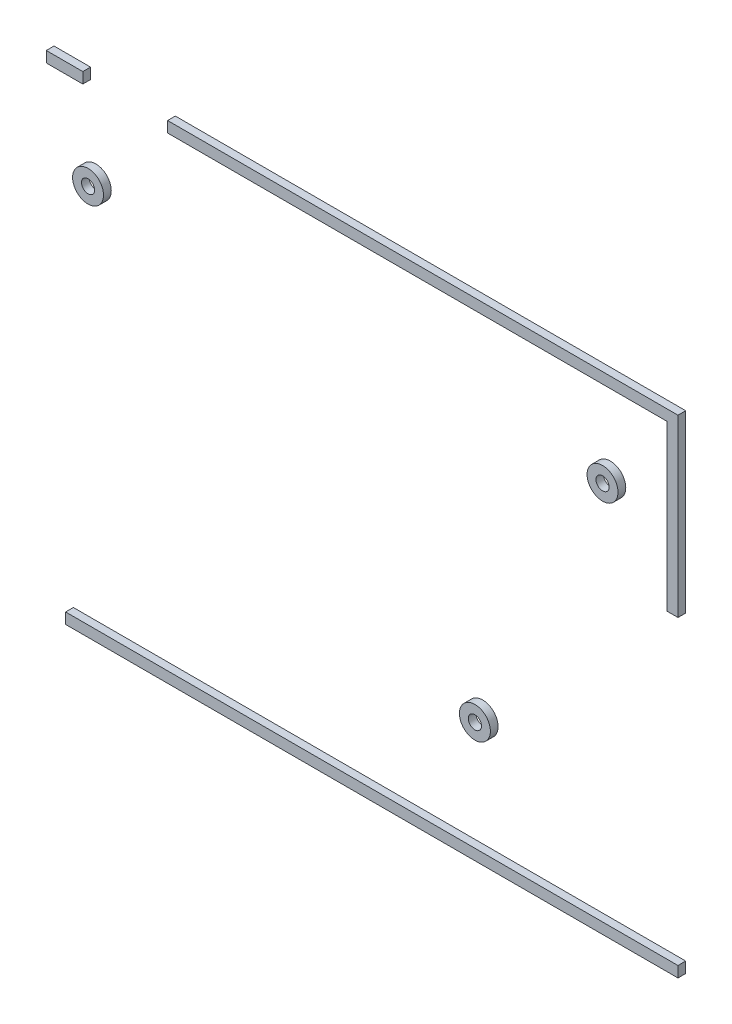
ISO-10303-21;
HEADER;
FILE_DESCRIPTION(('STEP AP214'),'2;1');
FILE_NAME('part.step','',(''),(''),'','','');
FILE_SCHEMA(('AUTOMOTIVE_DESIGN { 1 0 10303 214 1 1 1 1 }'));
ENDSEC;
DATA;
#1=APPLICATION_CONTEXT('core data for automotive mechanical design processes');
#2=APPLICATION_PROTOCOL_DEFINITION('international standard','automotive_design',2000,#1);
#3=PRODUCT_CONTEXT('',#1,'mechanical');
#4=PRODUCT('Part','Part','',(#3));
#5=PRODUCT_RELATED_PRODUCT_CATEGORY('part','',(#4));
#6=PRODUCT_DEFINITION_FORMATION('','',#4);
#7=PRODUCT_DEFINITION_CONTEXT('part definition',#1,'design');
#8=PRODUCT_DEFINITION('design','',#6,#7);
#9=PRODUCT_DEFINITION_SHAPE('','',#8);
#10=(LENGTH_UNIT() NAMED_UNIT(*) SI_UNIT(.MILLI.,.METRE.));
#11=(NAMED_UNIT(*) PLANE_ANGLE_UNIT() SI_UNIT($,.RADIAN.));
#12=(NAMED_UNIT(*) SI_UNIT($,.STERADIAN.) SOLID_ANGLE_UNIT());
#13=UNCERTAINTY_MEASURE_WITH_UNIT(LENGTH_MEASURE(1.E-05),#10,'distance_accuracy_value','');
#14=(GEOMETRIC_REPRESENTATION_CONTEXT(3) GLOBAL_UNCERTAINTY_ASSIGNED_CONTEXT((#13)) GLOBAL_UNIT_ASSIGNED_CONTEXT((#10,
#11,#12)) REPRESENTATION_CONTEXT('',''));
#15=CARTESIAN_POINT('',(0.,0.,0.));
#16=DIRECTION('',(0.,0.,1.));
#17=DIRECTION('',(1.,0.,0.));
#18=AXIS2_PLACEMENT_3D('',#15,#16,#17);
#19=CARTESIAN_POINT('',(176.,0.,160.32476117146));
#20=DIRECTION('',(1.,0.,0.));
#21=DIRECTION('',(0.,0.,-1.));
#22=AXIS2_PLACEMENT_3D('',#19,#20,#21);
#23=PLANE('',#22);
#24=DIRECTION('',(0.,0.,-1.));
#25=VECTOR('',#24,1.);
#26=CARTESIAN_POINT('',(176.,-60.2,160.32476117146));
#27=LINE('',#26,#25);
#28=CARTESIAN_POINT('',(176.,-60.2,2.));
#29=VERTEX_POINT('',#28);
#30=CARTESIAN_POINT('',(176.,-60.2,0.));
#31=VERTEX_POINT('',#30);
#32=EDGE_CURVE('E111',#29,#31,#27,.T.);
#33=ORIENTED_EDGE('',*,*,#32,.F.);
#34=DIRECTION('',(0.,1.,0.));
#35=VECTOR('',#34,1.);
#36=CARTESIAN_POINT('',(176.,0.,2.));
#37=LINE('',#36,#35);
#38=CARTESIAN_POINT('',(176.,-63.,2.));
#39=VERTEX_POINT('',#38);
#40=EDGE_CURVE('E70',#29,#39,#37,.F.);
#41=ORIENTED_EDGE('',*,*,#40,.T.);
#42=DIRECTION('',(0.,0.,-1.));
#43=VECTOR('',#42,1.);
#44=CARTESIAN_POINT('',(176.,-63.,160.32476117146));
#45=LINE('',#44,#43);
#46=CARTESIAN_POINT('',(176.,-63.,0.));
#47=VERTEX_POINT('',#46);
#48=EDGE_CURVE('E109',#39,#47,#45,.T.);
#49=ORIENTED_EDGE('',*,*,#48,.T.);
#50=DIRECTION('',(0.,-1.,0.));
#51=VECTOR('',#50,1.);
#52=CARTESIAN_POINT('',(176.,0.,0.));
#53=LINE('',#52,#51);
#54=EDGE_CURVE('E125',#31,#47,#53,.T.);
#55=ORIENTED_EDGE('',*,*,#54,.F.);
#56=EDGE_LOOP('',(#33,#41,#49,#55));
#57=FACE_BOUND('',#56,.T.);
#58=ADVANCED_FACE('F66',(#57),#23,.T.);
#59=CARTESIAN_POINT('',(0.,-60.2,160.32476117146));
#60=DIRECTION('',(0.,1.,0.));
#61=DIRECTION('',(0.,0.,1.));
#62=AXIS2_PLACEMENT_3D('',#59,#60,#61);
#63=PLANE('',#62);
#64=DIRECTION('',(0.,0.,-1.));
#65=VECTOR('',#64,1.);
#66=CARTESIAN_POINT('',(17.7,-60.2,160.32476117146));
#67=LINE('',#66,#65);
#68=CARTESIAN_POINT('',(17.7,-60.2,2.));
#69=VERTEX_POINT('',#68);
#70=CARTESIAN_POINT('',(17.7,-60.2,0.));
#71=VERTEX_POINT('',#70);
#72=EDGE_CURVE('E135',#69,#71,#67,.T.);
#73=ORIENTED_EDGE('',*,*,#72,.F.);
#74=DIRECTION('',(1.,0.,0.));
#75=VECTOR('',#74,1.);
#76=CARTESIAN_POINT('',(0.,-60.2,2.));
#77=LINE('',#76,#75);
#78=EDGE_CURVE('E85',#69,#29,#77,.T.);
#79=ORIENTED_EDGE('',*,*,#78,.T.);
#80=ORIENTED_EDGE('',*,*,#32,.T.);
#81=DIRECTION('',(1.,0.,0.));
#82=VECTOR('',#81,1.);
#83=CARTESIAN_POINT('',(0.,-60.2,0.));
#84=LINE('',#83,#82);
#85=EDGE_CURVE('E123',#71,#31,#84,.T.);
#86=ORIENTED_EDGE('',*,*,#85,.F.);
#87=EDGE_LOOP('',(#73,#79,#80,#86));
#88=FACE_BOUND('',#87,.T.);
#89=ADVANCED_FACE('F138',(#88),#63,.T.);
#90=CARTESIAN_POINT('',(17.7,0.,160.32476117146));
#91=DIRECTION('',(1.,0.,0.));
#92=DIRECTION('',(0.,0.,-1.));
#93=AXIS2_PLACEMENT_3D('',#90,#91,#92);
#94=PLANE('',#93);
#95=DIRECTION('',(0.,-1.,0.));
#96=VECTOR('',#95,1.);
#97=CARTESIAN_POINT('',(17.7,0.,2.));
#98=LINE('',#97,#96);
#99=CARTESIAN_POINT('',(17.7,-63.,2.));
#100=VERTEX_POINT('',#99);
#101=EDGE_CURVE('E77',#69,#100,#98,.T.);
#102=ORIENTED_EDGE('',*,*,#101,.F.);
#103=ORIENTED_EDGE('',*,*,#72,.T.);
#104=DIRECTION('',(0.,-1.,0.));
#105=VECTOR('',#104,1.);
#106=CARTESIAN_POINT('',(17.7,0.,0.));
#107=LINE('',#106,#105);
#108=CARTESIAN_POINT('',(17.7,-63.,0.));
#109=VERTEX_POINT('',#108);
#110=EDGE_CURVE('E132',#71,#109,#107,.T.);
#111=ORIENTED_EDGE('',*,*,#110,.T.);
#112=DIRECTION('',(0.,0.,-1.));
#113=VECTOR('',#112,1.);
#114=CARTESIAN_POINT('',(17.7,-63.,160.32476117146));
#115=LINE('',#114,#113);
#116=EDGE_CURVE('E120',#100,#109,#115,.T.);
#117=ORIENTED_EDGE('',*,*,#116,.F.);
#118=EDGE_LOOP('',(#102,#103,#111,#117));
#119=FACE_BOUND('',#118,.T.);
#120=ADVANCED_FACE('F142',(#119),#94,.F.);
#121=CARTESIAN_POINT('',(0.,-63.,160.32476117146));
#122=DIRECTION('',(0.,1.,0.));
#123=DIRECTION('',(0.,0.,1.));
#124=AXIS2_PLACEMENT_3D('',#121,#122,#123);
#125=PLANE('',#124);
#126=DIRECTION('',(1.,0.,0.));
#127=VECTOR('',#126,1.);
#128=CARTESIAN_POINT('',(-0.103234931084,-63.,1.99999999999999));
#129=LINE('',#128,#127);
#130=EDGE_CURVE('E13',#100,#39,#129,.T.);
#131=ORIENTED_EDGE('',*,*,#130,.F.);
#132=ORIENTED_EDGE('',*,*,#116,.T.);
#133=DIRECTION('',(1.,0.,0.));
#134=VECTOR('',#133,1.);
#135=CARTESIAN_POINT('',(0.,-63.,0.));
#136=LINE('',#135,#134);
#137=EDGE_CURVE('E115',#109,#47,#136,.T.);
#138=ORIENTED_EDGE('',*,*,#137,.T.);
#139=ORIENTED_EDGE('',*,*,#48,.F.);
#140=EDGE_LOOP('',(#131,#132,#138,#139));
#141=FACE_BOUND('',#140,.T.);
#142=ADVANCED_FACE('F113',(#141),#125,.F.);
#143=CARTESIAN_POINT('',(0.,0.,0.));
#144=DIRECTION('',(0.,0.,1.));
#145=DIRECTION('',(1.,0.,0.));
#146=AXIS2_PLACEMENT_3D('',#143,#144,#145);
#147=PLANE('',#146);
#148=ORIENTED_EDGE('',*,*,#54,.T.);
#149=ORIENTED_EDGE('',*,*,#137,.F.);
#150=ORIENTED_EDGE('',*,*,#110,.F.);
#151=ORIENTED_EDGE('',*,*,#85,.T.);
#152=EDGE_LOOP('',(#148,#149,#150,#151));
#153=FACE_BOUND('',#152,.T.);
#154=ADVANCED_FACE('F139',(#153),#147,.F.);
#155=CARTESIAN_POINT('',(-0.103234931084,0.02377597202222,1.99999999999999));
#156=DIRECTION('',(0.,0.,1.));
#157=DIRECTION('',(1.,0.,0.));
#158=AXIS2_PLACEMENT_3D('',#155,#156,#157);
#159=PLANE('',#158);
#160=ORIENTED_EDGE('',*,*,#101,.T.);
#161=ORIENTED_EDGE('',*,*,#130,.T.);
#162=ORIENTED_EDGE('',*,*,#40,.F.);
#163=ORIENTED_EDGE('',*,*,#78,.F.);
#164=EDGE_LOOP('',(#160,#161,#162,#163));
#165=FACE_BOUND('',#164,.T.);
#166=ADVANCED_FACE('F68',(#165),#159,.T.);
#167=CLOSED_SHELL('',(#58,#89,#120,#142,#154,#166));
#168=MANIFOLD_SOLID_BREP('B2',#167);
#169=CARTESIAN_POINT('',(123.5,-32.,160.32476117146));
#170=DIRECTION('',(0.,0.,-1.));
#171=DIRECTION('',(-1.,0.,0.));
#172=AXIS2_PLACEMENT_3D('',#169,#170,#171);
#173=CYLINDRICAL_SURFACE('',#172,1.70000000000001);
#174=CARTESIAN_POINT('',(123.5,-32.,0.));
#175=DIRECTION('',(0.,0.,1.));
#176=DIRECTION('',(1.,0.,0.));
#177=AXIS2_PLACEMENT_3D('',#174,#175,#176);
#178=CIRCLE('',#177,1.70000000000001);
#179=CARTESIAN_POINT('',(125.2,-32.,0.));
#180=VERTEX_POINT('',#179);
#181=EDGE_CURVE('E212',#180,#180,#178,.T.);
#182=ORIENTED_EDGE('',*,*,#181,.F.);
#183=EDGE_LOOP('',(#182));
#184=FACE_BOUND('',#183,.T.);
#185=CARTESIAN_POINT('',(123.5,-32.,2.));
#186=DIRECTION('',(0.,0.,1.));
#187=DIRECTION('',(1.,0.,0.));
#188=AXIS2_PLACEMENT_3D('',#185,#186,#187);
#189=CIRCLE('',#188,1.70000000000001);
#190=CARTESIAN_POINT('',(125.2,-32.,2.));
#191=VERTEX_POINT('',#190);
#192=EDGE_CURVE('E221',#191,#191,#189,.T.);
#193=ORIENTED_EDGE('',*,*,#192,.T.);
#194=EDGE_LOOP('',(#193));
#195=FACE_BOUND('',#194,.T.);
#196=ADVANCED_FACE('F205',(#184,#195),#173,.F.);
#197=CARTESIAN_POINT('',(123.5,-32.,160.32476117146));
#198=DIRECTION('',(0.,0.,-1.));
#199=DIRECTION('',(-1.,0.,0.));
#200=AXIS2_PLACEMENT_3D('',#197,#198,#199);
#201=CYLINDRICAL_SURFACE('',#200,3.99999999999999);
#202=CARTESIAN_POINT('',(123.5,-32.,0.));
#203=DIRECTION('',(0.,0.,1.));
#204=DIRECTION('',(1.,0.,0.));
#205=AXIS2_PLACEMENT_3D('',#202,#203,#204);
#206=CIRCLE('',#205,3.99999999999999);
#207=CARTESIAN_POINT('',(127.5,-32.,0.));
#208=VERTEX_POINT('',#207);
#209=EDGE_CURVE('E216',#208,#208,#206,.T.);
#210=ORIENTED_EDGE('',*,*,#209,.T.);
#211=EDGE_LOOP('',(#210));
#212=FACE_BOUND('',#211,.T.);
#213=CARTESIAN_POINT('',(123.5,-32.,2.));
#214=DIRECTION('',(0.,0.,1.));
#215=DIRECTION('',(1.,0.,0.));
#216=AXIS2_PLACEMENT_3D('',#213,#214,#215);
#217=CIRCLE('',#216,3.99999999999999);
#218=CARTESIAN_POINT('',(127.5,-32.,2.));
#219=VERTEX_POINT('',#218);
#220=EDGE_CURVE('E65',#219,#219,#217,.T.);
#221=ORIENTED_EDGE('',*,*,#220,.F.);
#222=EDGE_LOOP('',(#221));
#223=FACE_BOUND('',#222,.T.);
#224=ADVANCED_FACE('F232',(#212,#223),#201,.T.);
#225=CARTESIAN_POINT('',(0.,0.,0.));
#226=DIRECTION('',(0.,0.,1.));
#227=DIRECTION('',(1.,0.,0.));
#228=AXIS2_PLACEMENT_3D('',#225,#226,#227);
#229=PLANE('',#228);
#230=ORIENTED_EDGE('',*,*,#181,.T.);
#231=EDGE_LOOP('',(#230));
#232=FACE_BOUND('',#231,.T.);
#233=ORIENTED_EDGE('',*,*,#209,.F.);
#234=EDGE_LOOP('',(#233));
#235=FACE_BOUND('',#234,.T.);
#236=ADVANCED_FACE('F228',(#232,#235),#229,.F.);
#237=CARTESIAN_POINT('',(-0.103234931084,0.02377597202222,1.99999999999999));
#238=DIRECTION('',(0.,0.,1.));
#239=DIRECTION('',(1.,0.,0.));
#240=AXIS2_PLACEMENT_3D('',#237,#238,#239);
#241=PLANE('',#240);
#242=ORIENTED_EDGE('',*,*,#192,.F.);
#243=EDGE_LOOP('',(#242));
#244=FACE_BOUND('',#243,.T.);
#245=ORIENTED_EDGE('',*,*,#220,.T.);
#246=EDGE_LOOP('',(#245));
#247=FACE_BOUND('',#246,.T.);
#248=ADVANCED_FACE('F207',(#244,#247),#241,.T.);
#249=CLOSED_SHELL('',(#196,#224,#236,#248));
#250=MANIFOLD_SOLID_BREP('B7',#249);
#251=CARTESIAN_POINT('',(156.5,38.,160.32476117146));
#252=DIRECTION('',(0.,0.,-1.));
#253=DIRECTION('',(-1.,0.,0.));
#254=AXIS2_PLACEMENT_3D('',#251,#252,#253);
#255=CYLINDRICAL_SURFACE('',#254,1.70000000000001);
#256=CARTESIAN_POINT('',(156.5,38.,0.));
#257=DIRECTION('',(0.,0.,1.));
#258=DIRECTION('',(1.,0.,0.));
#259=AXIS2_PLACEMENT_3D('',#256,#257,#258);
#260=CIRCLE('',#259,1.70000000000001);
#261=CARTESIAN_POINT('',(158.2,38.,0.));
#262=VERTEX_POINT('',#261);
#263=EDGE_CURVE('E283',#262,#262,#260,.T.);
#264=ORIENTED_EDGE('',*,*,#263,.F.);
#265=EDGE_LOOP('',(#264));
#266=FACE_BOUND('',#265,.T.);
#267=CARTESIAN_POINT('',(156.5,38.,2.));
#268=DIRECTION('',(0.,0.,1.));
#269=DIRECTION('',(1.,0.,0.));
#270=AXIS2_PLACEMENT_3D('',#267,#268,#269);
#271=CIRCLE('',#270,1.70000000000001);
#272=CARTESIAN_POINT('',(158.2,38.,2.));
#273=VERTEX_POINT('',#272);
#274=EDGE_CURVE('E292',#273,#273,#271,.T.);
#275=ORIENTED_EDGE('',*,*,#274,.T.);
#276=EDGE_LOOP('',(#275));
#277=FACE_BOUND('',#276,.T.);
#278=ADVANCED_FACE('F276',(#266,#277),#255,.F.);
#279=CARTESIAN_POINT('',(156.5,38.,160.32476117146));
#280=DIRECTION('',(0.,0.,-1.));
#281=DIRECTION('',(-1.,0.,0.));
#282=AXIS2_PLACEMENT_3D('',#279,#280,#281);
#283=CYLINDRICAL_SURFACE('',#282,3.99999999999999);
#284=CARTESIAN_POINT('',(156.5,38.,0.));
#285=DIRECTION('',(0.,0.,1.));
#286=DIRECTION('',(1.,0.,0.));
#287=AXIS2_PLACEMENT_3D('',#284,#285,#286);
#288=CIRCLE('',#287,3.99999999999999);
#289=CARTESIAN_POINT('',(160.5,38.,0.));
#290=VERTEX_POINT('',#289);
#291=EDGE_CURVE('E287',#290,#290,#288,.T.);
#292=ORIENTED_EDGE('',*,*,#291,.T.);
#293=EDGE_LOOP('',(#292));
#294=FACE_BOUND('',#293,.T.);
#295=CARTESIAN_POINT('',(156.5,38.,2.));
#296=DIRECTION('',(0.,0.,1.));
#297=DIRECTION('',(1.,0.,0.));
#298=AXIS2_PLACEMENT_3D('',#295,#296,#297);
#299=CIRCLE('',#298,3.99999999999999);
#300=CARTESIAN_POINT('',(160.5,38.,2.));
#301=VERTEX_POINT('',#300);
#302=EDGE_CURVE('E204',#301,#301,#299,.T.);
#303=ORIENTED_EDGE('',*,*,#302,.F.);
#304=EDGE_LOOP('',(#303));
#305=FACE_BOUND('',#304,.T.);
#306=ADVANCED_FACE('F303',(#294,#305),#283,.T.);
#307=CARTESIAN_POINT('',(0.,0.,0.));
#308=DIRECTION('',(0.,0.,1.));
#309=DIRECTION('',(1.,0.,0.));
#310=AXIS2_PLACEMENT_3D('',#307,#308,#309);
#311=PLANE('',#310);
#312=ORIENTED_EDGE('',*,*,#263,.T.);
#313=EDGE_LOOP('',(#312));
#314=FACE_BOUND('',#313,.T.);
#315=ORIENTED_EDGE('',*,*,#291,.F.);
#316=EDGE_LOOP('',(#315));
#317=FACE_BOUND('',#316,.T.);
#318=ADVANCED_FACE('F299',(#314,#317),#311,.F.);
#319=CARTESIAN_POINT('',(-0.103234931084,0.02377597202222,1.99999999999999));
#320=DIRECTION('',(0.,0.,1.));
#321=DIRECTION('',(1.,0.,0.));
#322=AXIS2_PLACEMENT_3D('',#319,#320,#321);
#323=PLANE('',#322);
#324=ORIENTED_EDGE('',*,*,#274,.F.);
#325=EDGE_LOOP('',(#324));
#326=FACE_BOUND('',#325,.T.);
#327=ORIENTED_EDGE('',*,*,#302,.T.);
#328=EDGE_LOOP('',(#327));
#329=FACE_BOUND('',#328,.T.);
#330=ADVANCED_FACE('F278',(#326,#329),#323,.T.);
#331=CLOSED_SHELL('',(#278,#306,#318,#330));
#332=MANIFOLD_SOLID_BREP('B60',#331);
#333=CARTESIAN_POINT('',(0.,63.,160.32476117146));
#334=DIRECTION('',(0.,-1.,0.));
#335=DIRECTION('',(0.,0.,-1.));
#336=AXIS2_PLACEMENT_3D('',#333,#334,#335);
#337=PLANE('',#336);
#338=DIRECTION('',(1.,0.,0.));
#339=VECTOR('',#338,1.);
#340=CARTESIAN_POINT('',(-0.103234931084,63.,1.99999999999999));
#341=LINE('',#340,#339);
#342=CARTESIAN_POINT('',(176.,63.,1.99999999999999));
#343=VERTEX_POINT('',#342);
#344=CARTESIAN_POINT('',(44.0607929126358,63.,2.));
#345=VERTEX_POINT('',#344);
#346=EDGE_CURVE('E274',#343,#345,#341,.F.);
#347=ORIENTED_EDGE('',*,*,#346,.F.);
#348=DIRECTION('',(0.,0.,-1.));
#349=VECTOR('',#348,1.);
#350=CARTESIAN_POINT('',(176.,63.,160.32476117146));
#351=LINE('',#350,#349);
#352=CARTESIAN_POINT('',(176.,63.,0.));
#353=VERTEX_POINT('',#352);
#354=EDGE_CURVE('E429',#343,#353,#351,.T.);
#355=ORIENTED_EDGE('',*,*,#354,.T.);
#356=DIRECTION('',(-1.,0.,0.));
#357=VECTOR('',#356,1.);
#358=CARTESIAN_POINT('',(0.,63.,0.));
#359=LINE('',#358,#357);
#360=CARTESIAN_POINT('',(44.0607929126358,63.,0.));
#361=VERTEX_POINT('',#360);
#362=EDGE_CURVE('E418',#353,#361,#359,.T.);
#363=ORIENTED_EDGE('',*,*,#362,.T.);
#364=DIRECTION('',(0.,0.,-1.));
#365=VECTOR('',#364,1.);
#366=CARTESIAN_POINT('',(44.0607929126358,63.,160.32476117146));
#367=LINE('',#366,#365);
#368=EDGE_CURVE('E424',#345,#361,#367,.T.);
#369=ORIENTED_EDGE('',*,*,#368,.F.);
#370=EDGE_LOOP('',(#347,#355,#363,#369));
#371=FACE_BOUND('',#370,.T.);
#372=ADVANCED_FACE('F345',(#371),#337,.F.);
#373=CARTESIAN_POINT('',(44.0607929126358,0.,160.32476117146));
#374=DIRECTION('',(1.,0.,0.));
#375=DIRECTION('',(0.,0.,-1.));
#376=AXIS2_PLACEMENT_3D('',#373,#374,#375);
#377=PLANE('',#376);
#378=DIRECTION('',(0.,-1.,0.));
#379=VECTOR('',#378,1.);
#380=CARTESIAN_POINT('',(44.0607929126358,0.,2.));
#381=LINE('',#380,#379);
#382=CARTESIAN_POINT('',(44.0607929126358,60.2,2.));
#383=VERTEX_POINT('',#382);
#384=EDGE_CURVE('E391',#345,#383,#381,.T.);
#385=ORIENTED_EDGE('',*,*,#384,.F.);
#386=ORIENTED_EDGE('',*,*,#368,.T.);
#387=DIRECTION('',(0.,-1.,0.));
#388=VECTOR('',#387,1.);
#389=CARTESIAN_POINT('',(44.0607929126358,0.,0.));
#390=LINE('',#389,#388);
#391=CARTESIAN_POINT('',(44.0607929126358,60.2,0.));
#392=VERTEX_POINT('',#391);
#393=EDGE_CURVE('E408',#361,#392,#390,.T.);
#394=ORIENTED_EDGE('',*,*,#393,.T.);
#395=DIRECTION('',(0.,0.,-1.));
#396=VECTOR('',#395,1.);
#397=CARTESIAN_POINT('',(44.0607929126358,60.2,160.32476117146));
#398=LINE('',#397,#396);
#399=EDGE_CURVE('E405',#383,#392,#398,.T.);
#400=ORIENTED_EDGE('',*,*,#399,.F.);
#401=EDGE_LOOP('',(#385,#386,#394,#400));
#402=FACE_BOUND('',#401,.T.);
#403=ADVANCED_FACE('F410',(#402),#377,.F.);
#404=CARTESIAN_POINT('',(0.,60.2,160.32476117146));
#405=DIRECTION('',(0.,-1.,0.));
#406=DIRECTION('',(0.,0.,-1.));
#407=AXIS2_PLACEMENT_3D('',#404,#405,#406);
#408=PLANE('',#407);
#409=DIRECTION('',(0.,0.,-1.));
#410=VECTOR('',#409,1.);
#411=CARTESIAN_POINT('',(173.2,60.2,160.32476117146));
#412=LINE('',#411,#410);
#413=CARTESIAN_POINT('',(173.2,60.2,2.));
#414=VERTEX_POINT('',#413);
#415=CARTESIAN_POINT('',(173.2,60.2,0.));
#416=VERTEX_POINT('',#415);
#417=EDGE_CURVE('E407',#414,#416,#412,.T.);
#418=ORIENTED_EDGE('',*,*,#417,.F.);
#419=DIRECTION('',(-1.,0.,0.));
#420=VECTOR('',#419,1.);
#421=CARTESIAN_POINT('',(0.,60.2,2.));
#422=LINE('',#421,#420);
#423=EDGE_CURVE('E393',#414,#383,#422,.T.);
#424=ORIENTED_EDGE('',*,*,#423,.T.);
#425=ORIENTED_EDGE('',*,*,#399,.T.);
#426=DIRECTION('',(-1.,0.,0.));
#427=VECTOR('',#426,1.);
#428=CARTESIAN_POINT('',(0.,60.2,0.));
#429=LINE('',#428,#427);
#430=EDGE_CURVE('E399',#416,#392,#429,.T.);
#431=ORIENTED_EDGE('',*,*,#430,.F.);
#432=EDGE_LOOP('',(#418,#424,#425,#431));
#433=FACE_BOUND('',#432,.T.);
#434=ADVANCED_FACE('F403',(#433),#408,.T.);
#435=CARTESIAN_POINT('',(173.2,0.,160.32476117146));
#436=DIRECTION('',(-1.,0.,0.));
#437=DIRECTION('',(0.,0.,1.));
#438=AXIS2_PLACEMENT_3D('',#435,#436,#437);
#439=PLANE('',#438);
#440=DIRECTION('',(0.,0.,-1.));
#441=VECTOR('',#440,1.);
#442=CARTESIAN_POINT('',(173.2,17.7,160.32476117146));
#443=LINE('',#442,#441);
#444=CARTESIAN_POINT('',(173.2,17.7,2.));
#445=VERTEX_POINT('',#444);
#446=CARTESIAN_POINT('',(173.2,17.7,0.));
#447=VERTEX_POINT('',#446);
#448=EDGE_CURVE('E421',#445,#447,#443,.T.);
#449=ORIENTED_EDGE('',*,*,#448,.F.);
#450=DIRECTION('',(0.,1.,0.));
#451=VECTOR('',#450,1.);
#452=CARTESIAN_POINT('',(173.2,0.,2.));
#453=LINE('',#452,#451);
#454=EDGE_CURVE('E413',#445,#414,#453,.T.);
#455=ORIENTED_EDGE('',*,*,#454,.T.);
#456=ORIENTED_EDGE('',*,*,#417,.T.);
#457=DIRECTION('',(0.,1.,0.));
#458=VECTOR('',#457,1.);
#459=CARTESIAN_POINT('',(173.2,0.,0.));
#460=LINE('',#459,#458);
#461=EDGE_CURVE('E458',#447,#416,#460,.T.);
#462=ORIENTED_EDGE('',*,*,#461,.F.);
#463=EDGE_LOOP('',(#449,#455,#456,#462));
#464=FACE_BOUND('',#463,.T.);
#465=ADVANCED_FACE('F463',(#464),#439,.T.);
#466=CARTESIAN_POINT('',(0.,17.7,160.32476117146));
#467=DIRECTION('',(0.,1.,0.));
#468=DIRECTION('',(0.,0.,1.));
#469=AXIS2_PLACEMENT_3D('',#466,#467,#468);
#470=PLANE('',#469);
#471=DIRECTION('',(1.,0.,0.));
#472=VECTOR('',#471,1.);
#473=CARTESIAN_POINT('',(0.,17.7,2.));
#474=LINE('',#473,#472);
#475=CARTESIAN_POINT('',(176.,17.7,2.));
#476=VERTEX_POINT('',#475);
#477=EDGE_CURVE('E398',#445,#476,#474,.T.);
#478=ORIENTED_EDGE('',*,*,#477,.F.);
#479=ORIENTED_EDGE('',*,*,#448,.T.);
#480=DIRECTION('',(1.,0.,0.));
#481=VECTOR('',#480,1.);
#482=CARTESIAN_POINT('',(0.,17.7,0.));
#483=LINE('',#482,#481);
#484=CARTESIAN_POINT('',(176.,17.7,0.));
#485=VERTEX_POINT('',#484);
#486=EDGE_CURVE('E422',#447,#485,#483,.T.);
#487=ORIENTED_EDGE('',*,*,#486,.T.);
#488=DIRECTION('',(0.,0.,-1.));
#489=VECTOR('',#488,1.);
#490=CARTESIAN_POINT('',(176.,17.7,160.32476117146));
#491=LINE('',#490,#489);
#492=EDGE_CURVE('E426',#476,#485,#491,.T.);
#493=ORIENTED_EDGE('',*,*,#492,.F.);
#494=EDGE_LOOP('',(#478,#479,#487,#493));
#495=FACE_BOUND('',#494,.T.);
#496=ADVANCED_FACE('F443',(#495),#470,.F.);
#497=CARTESIAN_POINT('',(176.,0.,160.32476117146));
#498=DIRECTION('',(-1.,0.,0.));
#499=DIRECTION('',(0.,0.,1.));
#500=AXIS2_PLACEMENT_3D('',#497,#498,#499);
#501=PLANE('',#500);
#502=DIRECTION('',(0.,1.,0.));
#503=VECTOR('',#502,1.);
#504=CARTESIAN_POINT('',(176.,0.02377597202222,1.99999999999999));
#505=LINE('',#504,#503);
#506=EDGE_CURVE('E354',#476,#343,#505,.T.);
#507=ORIENTED_EDGE('',*,*,#506,.F.);
#508=ORIENTED_EDGE('',*,*,#492,.T.);
#509=DIRECTION('',(0.,1.,0.));
#510=VECTOR('',#509,1.);
#511=CARTESIAN_POINT('',(176.,0.,0.));
#512=LINE('',#511,#510);
#513=EDGE_CURVE('E428',#485,#353,#512,.T.);
#514=ORIENTED_EDGE('',*,*,#513,.T.);
#515=ORIENTED_EDGE('',*,*,#354,.F.);
#516=EDGE_LOOP('',(#507,#508,#514,#515));
#517=FACE_BOUND('',#516,.T.);
#518=ADVANCED_FACE('F449',(#517),#501,.F.);
#519=CARTESIAN_POINT('',(0.,0.,0.));
#520=DIRECTION('',(0.,0.,1.));
#521=DIRECTION('',(1.,0.,0.));
#522=AXIS2_PLACEMENT_3D('',#519,#520,#521);
#523=PLANE('',#522);
#524=ORIENTED_EDGE('',*,*,#362,.F.);
#525=ORIENTED_EDGE('',*,*,#513,.F.);
#526=ORIENTED_EDGE('',*,*,#486,.F.);
#527=ORIENTED_EDGE('',*,*,#461,.T.);
#528=ORIENTED_EDGE('',*,*,#430,.T.);
#529=ORIENTED_EDGE('',*,*,#393,.F.);
#530=EDGE_LOOP('',(#524,#525,#526,#527,#528,#529));
#531=FACE_BOUND('',#530,.T.);
#532=ADVANCED_FACE('F454',(#531),#523,.F.);
#533=CARTESIAN_POINT('',(-0.103234931084,0.02377597202222,1.99999999999999));
#534=DIRECTION('',(0.,0.,1.));
#535=DIRECTION('',(1.,0.,0.));
#536=AXIS2_PLACEMENT_3D('',#533,#534,#535);
#537=PLANE('',#536);
#538=ORIENTED_EDGE('',*,*,#384,.T.);
#539=ORIENTED_EDGE('',*,*,#423,.F.);
#540=ORIENTED_EDGE('',*,*,#454,.F.);
#541=ORIENTED_EDGE('',*,*,#477,.T.);
#542=ORIENTED_EDGE('',*,*,#506,.T.);
#543=ORIENTED_EDGE('',*,*,#346,.T.);
#544=EDGE_LOOP('',(#538,#539,#540,#541,#542,#543));
#545=FACE_BOUND('',#544,.T.);
#546=ADVANCED_FACE('F347',(#545),#537,.T.);
#547=CLOSED_SHELL('',(#372,#403,#434,#465,#496,#518,#532,#546));
#548=MANIFOLD_SOLID_BREP('B199',#547);
#549=CARTESIAN_POINT('',(23.5,38.,160.32476117146));
#550=DIRECTION('',(0.,0.,-1.));
#551=DIRECTION('',(-1.,0.,0.));
#552=AXIS2_PLACEMENT_3D('',#549,#550,#551);
#553=CYLINDRICAL_SURFACE('',#552,1.7);
#554=CARTESIAN_POINT('',(23.5,38.,0.));
#555=DIRECTION('',(0.,0.,1.));
#556=DIRECTION('',(1.,0.,0.));
#557=AXIS2_PLACEMENT_3D('',#554,#555,#556);
#558=CIRCLE('',#557,1.7);
#559=CARTESIAN_POINT('',(25.2,38.,0.));
#560=VERTEX_POINT('',#559);
#561=EDGE_CURVE('E553',#560,#560,#558,.T.);
#562=ORIENTED_EDGE('',*,*,#561,.F.);
#563=EDGE_LOOP('',(#562));
#564=FACE_BOUND('',#563,.T.);
#565=CARTESIAN_POINT('',(23.5,38.,2.));
#566=DIRECTION('',(0.,0.,1.));
#567=DIRECTION('',(1.,0.,0.));
#568=AXIS2_PLACEMENT_3D('',#565,#566,#567);
#569=CIRCLE('',#568,1.7);
#570=CARTESIAN_POINT('',(25.2,38.,2.));
#571=VERTEX_POINT('',#570);
#572=EDGE_CURVE('E562',#571,#571,#569,.T.);
#573=ORIENTED_EDGE('',*,*,#572,.T.);
#574=EDGE_LOOP('',(#573));
#575=FACE_BOUND('',#574,.T.);
#576=ADVANCED_FACE('F546',(#564,#575),#553,.F.);
#577=CARTESIAN_POINT('',(23.5,38.,160.32476117146));
#578=DIRECTION('',(0.,0.,-1.));
#579=DIRECTION('',(-1.,0.,0.));
#580=AXIS2_PLACEMENT_3D('',#577,#578,#579);
#581=CYLINDRICAL_SURFACE('',#580,4.);
#582=CARTESIAN_POINT('',(23.5,38.,0.));
#583=DIRECTION('',(0.,0.,1.));
#584=DIRECTION('',(1.,0.,0.));
#585=AXIS2_PLACEMENT_3D('',#582,#583,#584);
#586=CIRCLE('',#585,4.);
#587=CARTESIAN_POINT('',(27.5,38.,0.));
#588=VERTEX_POINT('',#587);
#589=EDGE_CURVE('E557',#588,#588,#586,.T.);
#590=ORIENTED_EDGE('',*,*,#589,.T.);
#591=EDGE_LOOP('',(#590));
#592=FACE_BOUND('',#591,.T.);
#593=CARTESIAN_POINT('',(23.5,38.,2.));
#594=DIRECTION('',(0.,0.,1.));
#595=DIRECTION('',(1.,0.,0.));
#596=AXIS2_PLACEMENT_3D('',#593,#594,#595);
#597=CIRCLE('',#596,4.);
#598=CARTESIAN_POINT('',(27.5,38.,2.));
#599=VERTEX_POINT('',#598);
#600=EDGE_CURVE('E344',#599,#599,#597,.T.);
#601=ORIENTED_EDGE('',*,*,#600,.F.);
#602=EDGE_LOOP('',(#601));
#603=FACE_BOUND('',#602,.T.);
#604=ADVANCED_FACE('F573',(#592,#603),#581,.T.);
#605=CARTESIAN_POINT('',(0.,0.,0.));
#606=DIRECTION('',(0.,0.,1.));
#607=DIRECTION('',(1.,0.,0.));
#608=AXIS2_PLACEMENT_3D('',#605,#606,#607);
#609=PLANE('',#608);
#610=ORIENTED_EDGE('',*,*,#561,.T.);
#611=EDGE_LOOP('',(#610));
#612=FACE_BOUND('',#611,.T.);
#613=ORIENTED_EDGE('',*,*,#589,.F.);
#614=EDGE_LOOP('',(#613));
#615=FACE_BOUND('',#614,.T.);
#616=ADVANCED_FACE('F569',(#612,#615),#609,.F.);
#617=CARTESIAN_POINT('',(-0.103234931084,0.02377597202222,1.99999999999999));
#618=DIRECTION('',(0.,0.,1.));
#619=DIRECTION('',(1.,0.,0.));
#620=AXIS2_PLACEMENT_3D('',#617,#618,#619);
#621=PLANE('',#620);
#622=ORIENTED_EDGE('',*,*,#572,.F.);
#623=EDGE_LOOP('',(#622));
#624=FACE_BOUND('',#623,.T.);
#625=ORIENTED_EDGE('',*,*,#600,.T.);
#626=EDGE_LOOP('',(#625));
#627=FACE_BOUND('',#626,.T.);
#628=ADVANCED_FACE('F548',(#624,#627),#621,.T.);
#629=CLOSED_SHELL('',(#576,#604,#616,#628));
#630=MANIFOLD_SOLID_BREP('B268',#629);
#631=CARTESIAN_POINT('',(0.,0.,0.));
#632=DIRECTION('',(0.,0.,1.));
#633=DIRECTION('',(1.,0.,0.));
#634=AXIS2_PLACEMENT_3D('',#631,#632,#633);
#635=PLANE('',#634);
#636=DIRECTION('',(1.,0.,0.));
#637=VECTOR('',#636,1.);
#638=CARTESIAN_POINT('',(0.,60.2,0.));
#639=LINE('',#638,#637);
#640=CARTESIAN_POINT('',(12.7,60.2,0.));
#641=VERTEX_POINT('',#640);
#642=CARTESIAN_POINT('',(22.1392070873642,60.2,0.));
#643=VERTEX_POINT('',#642);
#644=EDGE_CURVE('E663',#641,#643,#639,.T.);
#645=ORIENTED_EDGE('',*,*,#644,.F.);
#646=DIRECTION('',(0.,1.,0.));
#647=VECTOR('',#646,1.);
#648=CARTESIAN_POINT('',(12.7,0.,0.));
#649=LINE('',#648,#647);
#650=CARTESIAN_POINT('',(12.7,63.,0.));
#651=VERTEX_POINT('',#650);
#652=EDGE_CURVE('E672',#641,#651,#649,.T.);
#653=ORIENTED_EDGE('',*,*,#652,.T.);
#654=DIRECTION('',(1.,0.,0.));
#655=VECTOR('',#654,1.);
#656=CARTESIAN_POINT('',(0.,63.,0.));
#657=LINE('',#656,#655);
#658=CARTESIAN_POINT('',(22.1392070873642,63.,0.));
#659=VERTEX_POINT('',#658);
#660=EDGE_CURVE('E666',#651,#659,#657,.T.);
#661=ORIENTED_EDGE('',*,*,#660,.T.);
#662=DIRECTION('',(0.,1.,0.));
#663=VECTOR('',#662,1.);
#664=CARTESIAN_POINT('',(22.1392070873642,0.,0.));
#665=LINE('',#664,#663);
#666=EDGE_CURVE('E657',#643,#659,#665,.T.);
#667=ORIENTED_EDGE('',*,*,#666,.F.);
#668=EDGE_LOOP('',(#645,#653,#661,#667));
#669=FACE_BOUND('',#668,.T.);
#670=ADVANCED_FACE('F607',(#669),#635,.F.);
#671=CARTESIAN_POINT('',(12.7,0.,160.32476117146));
#672=DIRECTION('',(-1.,0.,0.));
#673=DIRECTION('',(0.,0.,1.));
#674=AXIS2_PLACEMENT_3D('',#671,#672,#673);
#675=PLANE('',#674);
#676=DIRECTION('',(0.,0.,-1.));
#677=VECTOR('',#676,1.);
#678=CARTESIAN_POINT('',(12.7,60.2,160.32476117146));
#679=LINE('',#678,#677);
#680=CARTESIAN_POINT('',(12.7,60.2,2.));
#681=VERTEX_POINT('',#680);
#682=EDGE_CURVE('E641',#681,#641,#679,.T.);
#683=ORIENTED_EDGE('',*,*,#682,.F.);
#684=DIRECTION('',(0.,1.,0.));
#685=VECTOR('',#684,1.);
#686=CARTESIAN_POINT('',(12.7,0.,2.));
#687=LINE('',#686,#685);
#688=CARTESIAN_POINT('',(12.7,63.,2.));
#689=VERTEX_POINT('',#688);
#690=EDGE_CURVE('E628',#681,#689,#687,.T.);
#691=ORIENTED_EDGE('',*,*,#690,.T.);
#692=DIRECTION('',(0.,0.,-1.));
#693=VECTOR('',#692,1.);
#694=CARTESIAN_POINT('',(12.7,63.,160.32476117146));
#695=LINE('',#694,#693);
#696=EDGE_CURVE('E675',#689,#651,#695,.T.);
#697=ORIENTED_EDGE('',*,*,#696,.T.);
#698=ORIENTED_EDGE('',*,*,#652,.F.);
#699=EDGE_LOOP('',(#683,#691,#697,#698));
#700=FACE_BOUND('',#699,.T.);
#701=ADVANCED_FACE('F683',(#700),#675,.T.);
#702=CARTESIAN_POINT('',(0.,63.,160.32476117146));
#703=DIRECTION('',(0.,1.,0.));
#704=DIRECTION('',(0.,0.,1.));
#705=AXIS2_PLACEMENT_3D('',#702,#703,#704);
#706=PLANE('',#705);
#707=ORIENTED_EDGE('',*,*,#696,.F.);
#708=DIRECTION('',(1.,0.,0.));
#709=VECTOR('',#708,1.);
#710=CARTESIAN_POINT('',(0.,63.,2.));
#711=LINE('',#710,#709);
#712=CARTESIAN_POINT('',(22.1392070873642,63.,2.));
#713=VERTEX_POINT('',#712);
#714=EDGE_CURVE('E611',#689,#713,#711,.T.);
#715=ORIENTED_EDGE('',*,*,#714,.T.);
#716=DIRECTION('',(0.,0.,-1.));
#717=VECTOR('',#716,1.);
#718=CARTESIAN_POINT('',(22.1392070873642,63.,160.32476117146));
#719=LINE('',#718,#717);
#720=EDGE_CURVE('E659',#713,#659,#719,.T.);
#721=ORIENTED_EDGE('',*,*,#720,.T.);
#722=ORIENTED_EDGE('',*,*,#660,.F.);
#723=EDGE_LOOP('',(#707,#715,#721,#722));
#724=FACE_BOUND('',#723,.T.);
#725=ADVANCED_FACE('F682',(#724),#706,.T.);
#726=CARTESIAN_POINT('',(22.1392070873642,0.,160.32476117146));
#727=DIRECTION('',(-1.,0.,0.));
#728=DIRECTION('',(0.,0.,1.));
#729=AXIS2_PLACEMENT_3D('',#726,#727,#728);
#730=PLANE('',#729);
#731=DIRECTION('',(0.,1.,0.));
#732=VECTOR('',#731,1.);
#733=CARTESIAN_POINT('',(22.1392070873642,0.,2.));
#734=LINE('',#733,#732);
#735=CARTESIAN_POINT('',(22.1392070873642,60.2,2.));
#736=VERTEX_POINT('',#735);
#737=EDGE_CURVE('E616',#736,#713,#734,.T.);
#738=ORIENTED_EDGE('',*,*,#737,.F.);
#739=DIRECTION('',(0.,0.,-1.));
#740=VECTOR('',#739,1.);
#741=CARTESIAN_POINT('',(22.1392070873642,60.2,160.32476117146));
#742=LINE('',#741,#740);
#743=EDGE_CURVE('E654',#736,#643,#742,.T.);
#744=ORIENTED_EDGE('',*,*,#743,.T.);
#745=ORIENTED_EDGE('',*,*,#666,.T.);
#746=ORIENTED_EDGE('',*,*,#720,.F.);
#747=EDGE_LOOP('',(#738,#744,#745,#746));
#748=FACE_BOUND('',#747,.T.);
#749=ADVANCED_FACE('F656',(#748),#730,.F.);
#750=CARTESIAN_POINT('',(0.,60.2,160.32476117146));
#751=DIRECTION('',(0.,1.,0.));
#752=DIRECTION('',(0.,0.,1.));
#753=AXIS2_PLACEMENT_3D('',#750,#751,#752);
#754=PLANE('',#753);
#755=DIRECTION('',(1.,0.,0.));
#756=VECTOR('',#755,1.);
#757=CARTESIAN_POINT('',(0.,60.2,2.));
#758=LINE('',#757,#756);
#759=EDGE_CURVE('E544',#681,#736,#758,.T.);
#760=ORIENTED_EDGE('',*,*,#759,.F.);
#761=ORIENTED_EDGE('',*,*,#682,.T.);
#762=ORIENTED_EDGE('',*,*,#644,.T.);
#763=ORIENTED_EDGE('',*,*,#743,.F.);
#764=EDGE_LOOP('',(#760,#761,#762,#763));
#765=FACE_BOUND('',#764,.T.);
#766=ADVANCED_FACE('F609',(#765),#754,.F.);
#767=CARTESIAN_POINT('',(-0.103234931084,0.02377597202222,1.99999999999999));
#768=DIRECTION('',(0.,0.,1.));
#769=DIRECTION('',(1.,0.,0.));
#770=AXIS2_PLACEMENT_3D('',#767,#768,#769);
#771=PLANE('',#770);
#772=ORIENTED_EDGE('',*,*,#737,.T.);
#773=ORIENTED_EDGE('',*,*,#714,.F.);
#774=ORIENTED_EDGE('',*,*,#690,.F.);
#775=ORIENTED_EDGE('',*,*,#759,.T.);
#776=EDGE_LOOP('',(#772,#773,#774,#775));
#777=FACE_BOUND('',#776,.T.);
#778=ADVANCED_FACE('F697',(#777),#771,.T.);
#779=CLOSED_SHELL('',(#670,#701,#725,#749,#766,#778));
#780=MANIFOLD_SOLID_BREP('B339',#779);
#781=ADVANCED_BREP_SHAPE_REPRESENTATION('',(#18,#168,#250,#332,#548,#630,#780),#14);
#782=SHAPE_DEFINITION_REPRESENTATION(#9,#781);
ENDSEC;
END-ISO-10303-21;
